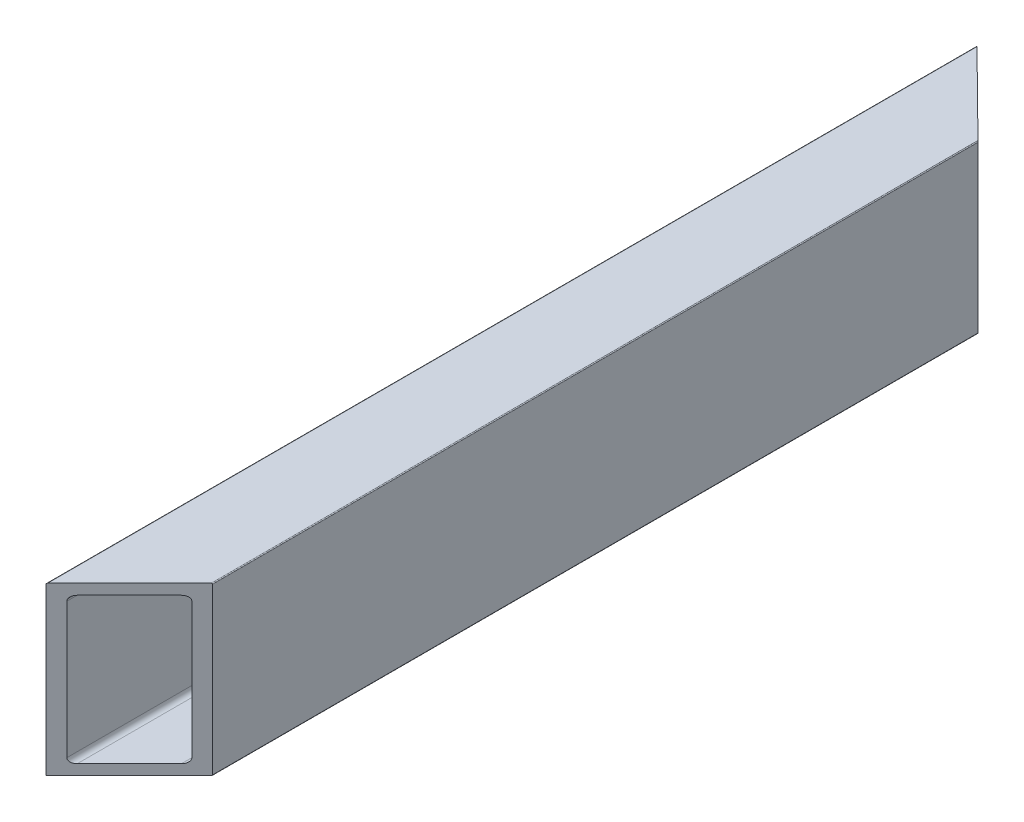
ISO-10303-21;
HEADER;
FILE_DESCRIPTION(('STEP AP214'),'2;1');
FILE_NAME('part.step','',(''),(''),'','','');
FILE_SCHEMA(('AUTOMOTIVE_DESIGN { 1 0 10303 214 1 1 1 1 }'));
ENDSEC;
DATA;
#1=APPLICATION_CONTEXT('core data for automotive mechanical design processes');
#2=APPLICATION_PROTOCOL_DEFINITION('international standard','automotive_design',2000,#1);
#3=PRODUCT_CONTEXT('',#1,'mechanical');
#4=PRODUCT('Part','Part','',(#3));
#5=PRODUCT_RELATED_PRODUCT_CATEGORY('part','',(#4));
#6=PRODUCT_DEFINITION_FORMATION('','',#4);
#7=PRODUCT_DEFINITION_CONTEXT('part definition',#1,'design');
#8=PRODUCT_DEFINITION('design','',#6,#7);
#9=PRODUCT_DEFINITION_SHAPE('','',#8);
#10=(LENGTH_UNIT() NAMED_UNIT(*) SI_UNIT(.MILLI.,.METRE.));
#11=(NAMED_UNIT(*) PLANE_ANGLE_UNIT() SI_UNIT($,.RADIAN.));
#12=(NAMED_UNIT(*) SI_UNIT($,.STERADIAN.) SOLID_ANGLE_UNIT());
#13=UNCERTAINTY_MEASURE_WITH_UNIT(LENGTH_MEASURE(1.E-05),#10,'distance_accuracy_value','');
#14=(GEOMETRIC_REPRESENTATION_CONTEXT(3) GLOBAL_UNCERTAINTY_ASSIGNED_CONTEXT((#13)) GLOBAL_UNIT_ASSIGNED_CONTEXT((#10,
#11,#12)) REPRESENTATION_CONTEXT('',''));
#15=CARTESIAN_POINT('',(0.,0.,0.));
#16=DIRECTION('',(0.,0.,1.));
#17=DIRECTION('',(1.,0.,0.));
#18=AXIS2_PLACEMENT_3D('',#15,#16,#17);
#19=CARTESIAN_POINT('',(3.175,4.7625,1828.8));
#20=DIRECTION('',(1.,0.,0.));
#21=DIRECTION('',(0.,1.,0.));
#22=AXIS2_PLACEMENT_3D('',#19,#20,#21);
#23=PLANE('',#22);
#24=DIRECTION('',(0.,1.,0.));
#25=VECTOR('',#24,1.);
#26=CARTESIAN_POINT('',(3.175,4.7625,280.506897551573));
#27=LINE('',#26,#25);
#28=CARTESIAN_POINT('',(3.175,4.7625,280.506897551572));
#29=VERTEX_POINT('',#28);
#30=CARTESIAN_POINT('',(3.175,46.0375,280.506897551572));
#31=VERTEX_POINT('',#30);
#32=EDGE_CURVE('E318',#29,#31,#27,.T.);
#33=ORIENTED_EDGE('',*,*,#32,.F.);
#34=DIRECTION('',(0.,0.,-1.));
#35=VECTOR('',#34,1.);
#36=CARTESIAN_POINT('',(3.175,4.7625,1828.8));
#37=LINE('',#36,#35);
#38=CARTESIAN_POINT('',(3.175,4.7625,3.13552437739006));
#39=VERTEX_POINT('',#38);
#40=EDGE_CURVE('E228',#29,#39,#37,.T.);
#41=ORIENTED_EDGE('',*,*,#40,.T.);
#42=DIRECTION('',(0.,-1.,0.));
#43=VECTOR('',#42,1.);
#44=CARTESIAN_POINT('',(3.175,4.7625,3.13552437739006));
#45=LINE('',#44,#43);
#46=CARTESIAN_POINT('',(3.175,46.0375,3.13552437739006));
#47=VERTEX_POINT('',#46);
#48=EDGE_CURVE('E273',#47,#39,#45,.T.);
#49=ORIENTED_EDGE('',*,*,#48,.F.);
#50=DIRECTION('',(0.,0.,-1.));
#51=VECTOR('',#50,1.);
#52=CARTESIAN_POINT('',(3.175,46.0375,1828.8));
#53=LINE('',#52,#51);
#54=EDGE_CURVE('E283',#31,#47,#53,.T.);
#55=ORIENTED_EDGE('',*,*,#54,.F.);
#56=EDGE_LOOP('',(#33,#41,#49,#55));
#57=FACE_BOUND('',#56,.T.);
#58=ADVANCED_FACE('F70',(#57),#23,.T.);
#59=CARTESIAN_POINT('',(4.7625,46.0375,1828.8));
#60=DIRECTION('',(0.,0.,-1.));
#61=DIRECTION('',(-1.,0.,0.));
#62=AXIS2_PLACEMENT_3D('',#59,#60,#61);
#63=CYLINDRICAL_SURFACE('',#62,1.5875);
#64=DIRECTION('',(0.,0.,-1.));
#65=VECTOR('',#64,1.);
#66=CARTESIAN_POINT('',(4.7625,47.625,1828.8));
#67=LINE('',#66,#65);
#68=CARTESIAN_POINT('',(4.76250000000011,47.625,278.919397551572));
#69=VERTEX_POINT('',#68);
#70=CARTESIAN_POINT('',(4.7625,47.625,4.70328656608532));
#71=VERTEX_POINT('',#70);
#72=EDGE_CURVE('E282',#69,#71,#67,.T.);
#73=ORIENTED_EDGE('',*,*,#72,.F.);
#74=CARTESIAN_POINT('',(4.7625,46.0375,278.919397551572));
#75=DIRECTION('',(-0.707106781186539,0.,-0.707106781186556));
#76=DIRECTION('',(0.707106781186556,0.,-0.707106781186539));
#77=AXIS2_PLACEMENT_3D('',#74,#75,#76);
#78=ELLIPSE('',#77,2.24506403026726,1.5875);
#79=EDGE_CURVE('E231',#69,#31,#78,.F.);
#80=ORIENTED_EDGE('',*,*,#79,.T.);
#81=ORIENTED_EDGE('',*,*,#54,.T.);
#82=CARTESIAN_POINT('',(4.7625,46.0375,4.70328656608521));
#83=DIRECTION('',(-0.702669711180683,0.,0.711516181818274));
#84=DIRECTION('',(-0.711516181818274,0.,-0.702669711180683));
#85=AXIS2_PLACEMENT_3D('',#82,#83,#84);
#86=ELLIPSE('',#85,2.23115094296683,1.5875);
#87=EDGE_CURVE('E278',#47,#71,#86,.F.);
#88=ORIENTED_EDGE('',*,*,#87,.T.);
#89=EDGE_LOOP('',(#73,#80,#81,#88));
#90=FACE_BOUND('',#89,.T.);
#91=ADVANCED_FACE('F372',(#90),#63,.F.);
#92=CARTESIAN_POINT('',(4.7625,47.625,1828.8));
#93=DIRECTION('',(0.,-1.,0.));
#94=DIRECTION('',(0.,0.,-1.));
#95=AXIS2_PLACEMENT_3D('',#92,#93,#94);
#96=PLANE('',#95);
#97=DIRECTION('',(0.707106781186556,0.,-0.707106781186539));
#98=VECTOR('',#97,1.);
#99=CARTESIAN_POINT('',(-770.177801224214,47.625,1053.85969877577));
#100=LINE('',#99,#98);
#101=CARTESIAN_POINT('',(20.6375,47.625,263.044397551573));
#102=VERTEX_POINT('',#101);
#103=EDGE_CURVE('E197',#69,#102,#100,.T.);
#104=ORIENTED_EDGE('',*,*,#103,.F.);
#105=ORIENTED_EDGE('',*,*,#72,.T.);
#106=DIRECTION('',(-0.711516181818274,0.,-0.702669711180683));
#107=VECTOR('',#106,1.);
#108=CARTESIAN_POINT('',(916.739479773578,47.625,905.341413085324));
#109=LINE('',#108,#107);
#110=CARTESIAN_POINT('',(20.6375,47.625,20.3809084530353));
#111=VERTEX_POINT('',#110);
#112=EDGE_CURVE('E284',#111,#71,#109,.T.);
#113=ORIENTED_EDGE('',*,*,#112,.F.);
#114=DIRECTION('',(0.,0.,-1.));
#115=VECTOR('',#114,1.);
#116=CARTESIAN_POINT('',(20.6375,47.625,1828.8));
#117=LINE('',#116,#115);
#118=EDGE_CURVE('E293',#102,#111,#117,.T.);
#119=ORIENTED_EDGE('',*,*,#118,.F.);
#120=EDGE_LOOP('',(#104,#105,#113,#119));
#121=FACE_BOUND('',#120,.T.);
#122=ADVANCED_FACE('F369',(#121),#96,.T.);
#123=CARTESIAN_POINT('',(20.6375,46.0375,1828.8));
#124=DIRECTION('',(0.,0.,-1.));
#125=DIRECTION('',(-1.,0.,0.));
#126=AXIS2_PLACEMENT_3D('',#123,#124,#125);
#127=CYLINDRICAL_SURFACE('',#126,1.5875);
#128=DIRECTION('',(0.,0.,-1.));
#129=VECTOR('',#128,1.);
#130=CARTESIAN_POINT('',(22.225,46.0375,1828.8));
#131=LINE('',#130,#129);
#132=CARTESIAN_POINT('',(22.225,46.0375,261.456897551573));
#133=VERTEX_POINT('',#132);
#134=CARTESIAN_POINT('',(22.225,46.0375,21.9486706417302));
#135=VERTEX_POINT('',#134);
#136=EDGE_CURVE('E207',#133,#135,#131,.T.);
#137=ORIENTED_EDGE('',*,*,#136,.F.);
#138=CARTESIAN_POINT('',(20.6375,46.0375,263.044397551573));
#139=DIRECTION('',(-0.707106781186539,0.,-0.707106781186556));
#140=DIRECTION('',(0.707106781186556,0.,-0.707106781186539));
#141=AXIS2_PLACEMENT_3D('',#138,#139,#140);
#142=ELLIPSE('',#141,2.24506403026726,1.5875);
#143=EDGE_CURVE('E192',#133,#102,#142,.F.);
#144=ORIENTED_EDGE('',*,*,#143,.T.);
#145=ORIENTED_EDGE('',*,*,#118,.T.);
#146=CARTESIAN_POINT('',(20.6375,46.0375,20.3809084530353));
#147=DIRECTION('',(-0.702669711180683,0.,0.711516181818274));
#148=DIRECTION('',(-0.711516181818274,0.,-0.702669711180683));
#149=AXIS2_PLACEMENT_3D('',#146,#147,#148);
#150=ELLIPSE('',#149,2.23115094296683,1.5875);
#151=EDGE_CURVE('E289',#111,#135,#150,.F.);
#152=ORIENTED_EDGE('',*,*,#151,.T.);
#153=EDGE_LOOP('',(#137,#144,#145,#152));
#154=FACE_BOUND('',#153,.T.);
#155=ADVANCED_FACE('F361',(#154),#127,.F.);
#156=CARTESIAN_POINT('',(22.225,4.7625,1828.8));
#157=DIRECTION('',(-1.,0.,0.));
#158=DIRECTION('',(0.,0.,1.));
#159=AXIS2_PLACEMENT_3D('',#156,#157,#158);
#160=PLANE('',#159);
#161=DIRECTION('',(0.,-1.,0.));
#162=VECTOR('',#161,1.);
#163=CARTESIAN_POINT('',(22.225,4.7625,261.456897551573));
#164=LINE('',#163,#162);
#165=CARTESIAN_POINT('',(22.225,4.7625,261.456897551573));
#166=VERTEX_POINT('',#165);
#167=EDGE_CURVE('E187',#133,#166,#164,.T.);
#168=ORIENTED_EDGE('',*,*,#167,.F.);
#169=ORIENTED_EDGE('',*,*,#136,.T.);
#170=DIRECTION('',(0.,1.,0.));
#171=VECTOR('',#170,1.);
#172=CARTESIAN_POINT('',(22.225,4.7625,21.9486706417302));
#173=LINE('',#172,#171);
#174=CARTESIAN_POINT('',(22.225,4.7625,21.9486706417305));
#175=VERTEX_POINT('',#174);
#176=EDGE_CURVE('E212',#175,#135,#173,.T.);
#177=ORIENTED_EDGE('',*,*,#176,.F.);
#178=DIRECTION('',(0.,0.,-1.));
#179=VECTOR('',#178,1.);
#180=CARTESIAN_POINT('',(22.225,4.7625,1828.8));
#181=LINE('',#180,#179);
#182=EDGE_CURVE('E203',#166,#175,#181,.T.);
#183=ORIENTED_EDGE('',*,*,#182,.F.);
#184=EDGE_LOOP('',(#168,#169,#177,#183));
#185=FACE_BOUND('',#184,.T.);
#186=ADVANCED_FACE('F210',(#185),#160,.T.);
#187=CARTESIAN_POINT('',(20.6375,4.7625,1828.8));
#188=DIRECTION('',(0.,0.,-1.));
#189=DIRECTION('',(-1.,0.,0.));
#190=AXIS2_PLACEMENT_3D('',#187,#188,#189);
#191=CYLINDRICAL_SURFACE('',#190,1.5875);
#192=DIRECTION('',(0.,0.,-1.));
#193=VECTOR('',#192,1.);
#194=CARTESIAN_POINT('',(20.6375,3.175,1828.8));
#195=LINE('',#194,#193);
#196=CARTESIAN_POINT('',(20.6375,3.175,263.044397551573));
#197=VERTEX_POINT('',#196);
#198=CARTESIAN_POINT('',(20.6375,3.175,20.3809084530353));
#199=VERTEX_POINT('',#198);
#200=EDGE_CURVE('E205',#197,#199,#195,.T.);
#201=ORIENTED_EDGE('',*,*,#200,.F.);
#202=CARTESIAN_POINT('',(20.6375,4.7625,263.044397551573));
#203=DIRECTION('',(-0.707106781186539,0.,-0.707106781186556));
#204=DIRECTION('',(0.707106781186556,0.,-0.707106781186539));
#205=AXIS2_PLACEMENT_3D('',#202,#203,#204);
#206=ELLIPSE('',#205,2.24506403026726,1.5875);
#207=EDGE_CURVE('E190',#197,#166,#206,.F.);
#208=ORIENTED_EDGE('',*,*,#207,.T.);
#209=ORIENTED_EDGE('',*,*,#182,.T.);
#210=CARTESIAN_POINT('',(20.6375,4.7625,20.3809084530353));
#211=DIRECTION('',(-0.702669711180683,0.,0.711516181818274));
#212=DIRECTION('',(-0.711516181818274,0.,-0.702669711180683));
#213=AXIS2_PLACEMENT_3D('',#210,#211,#212);
#214=ELLIPSE('',#213,2.23115094296683,1.5875);
#215=EDGE_CURVE('E214',#175,#199,#214,.F.);
#216=ORIENTED_EDGE('',*,*,#215,.T.);
#217=EDGE_LOOP('',(#201,#208,#209,#216));
#218=FACE_BOUND('',#217,.T.);
#219=ADVANCED_FACE('F201',(#218),#191,.F.);
#220=CARTESIAN_POINT('',(4.7625,3.175,1828.8));
#221=DIRECTION('',(0.,1.,0.));
#222=DIRECTION('',(1.,0.,0.));
#223=AXIS2_PLACEMENT_3D('',#220,#221,#222);
#224=PLANE('',#223);
#225=DIRECTION('',(-0.707106781186556,0.,0.707106781186539));
#226=VECTOR('',#225,1.);
#227=CARTESIAN_POINT('',(-770.177801224214,3.175,1053.85969877577));
#228=LINE('',#227,#226);
#229=CARTESIAN_POINT('',(4.7625,3.175,278.919397551572));
#230=VERTEX_POINT('',#229);
#231=EDGE_CURVE('E120',#197,#230,#228,.T.);
#232=ORIENTED_EDGE('',*,*,#231,.F.);
#233=ORIENTED_EDGE('',*,*,#200,.T.);
#234=DIRECTION('',(0.711516181818274,0.,0.702669711180683));
#235=VECTOR('',#234,1.);
#236=CARTESIAN_POINT('',(916.739479773578,3.175,905.341413085324));
#237=LINE('',#236,#235);
#238=CARTESIAN_POINT('',(4.7625,3.175,4.70328656608521));
#239=VERTEX_POINT('',#238);
#240=EDGE_CURVE('E277',#239,#199,#237,.T.);
#241=ORIENTED_EDGE('',*,*,#240,.F.);
#242=DIRECTION('',(0.,0.,-1.));
#243=VECTOR('',#242,1.);
#244=CARTESIAN_POINT('',(4.7625,3.175,1828.8));
#245=LINE('',#244,#243);
#246=EDGE_CURVE('E224',#230,#239,#245,.T.);
#247=ORIENTED_EDGE('',*,*,#246,.F.);
#248=EDGE_LOOP('',(#232,#233,#241,#247));
#249=FACE_BOUND('',#248,.T.);
#250=ADVANCED_FACE('F383',(#249),#224,.T.);
#251=CARTESIAN_POINT('',(4.7625,4.7625,1828.8));
#252=DIRECTION('',(0.,0.,-1.));
#253=DIRECTION('',(-1.,0.,0.));
#254=AXIS2_PLACEMENT_3D('',#251,#252,#253);
#255=CYLINDRICAL_SURFACE('',#254,1.5875);
#256=ORIENTED_EDGE('',*,*,#40,.F.);
#257=CARTESIAN_POINT('',(4.7625,4.7625,278.919397551572));
#258=DIRECTION('',(-0.707106781186539,0.,-0.707106781186556));
#259=DIRECTION('',(0.707106781186556,0.,-0.707106781186539));
#260=AXIS2_PLACEMENT_3D('',#257,#258,#259);
#261=ELLIPSE('',#260,2.24506403026726,1.5875);
#262=EDGE_CURVE('E114',#29,#230,#261,.F.);
#263=ORIENTED_EDGE('',*,*,#262,.T.);
#264=ORIENTED_EDGE('',*,*,#246,.T.);
#265=CARTESIAN_POINT('',(4.7625,4.7625,4.70328656608521));
#266=DIRECTION('',(-0.702669711180683,0.,0.711516181818274));
#267=DIRECTION('',(-0.711516181818274,0.,-0.702669711180683));
#268=AXIS2_PLACEMENT_3D('',#265,#266,#267);
#269=ELLIPSE('',#268,2.23115094296683,1.5875);
#270=EDGE_CURVE('E227',#239,#39,#269,.F.);
#271=ORIENTED_EDGE('',*,*,#270,.T.);
#272=EDGE_LOOP('',(#256,#263,#264,#271));
#273=FACE_BOUND('',#272,.T.);
#274=ADVANCED_FACE('F379',(#273),#255,.F.);
#275=CARTESIAN_POINT('',(0.,0.254,1828.8));
#276=DIRECTION('',(1.,0.,0.));
#277=DIRECTION('',(0.,1.,0.));
#278=AXIS2_PLACEMENT_3D('',#275,#276,#277);
#279=PLANE('',#278);
#280=DIRECTION('',(0.,0.,-1.));
#281=VECTOR('',#280,1.);
#282=CARTESIAN_POINT('',(0.,0.254,1828.8));
#283=LINE('',#282,#281);
#284=CARTESIAN_POINT('',(0.,0.254,283.681897551572));
#285=VERTEX_POINT('',#284);
#286=CARTESIAN_POINT('',(0.,0.254,0.));
#287=VERTEX_POINT('',#286);
#288=EDGE_CURVE('E251',#285,#287,#283,.T.);
#289=ORIENTED_EDGE('',*,*,#288,.F.);
#290=DIRECTION('',(0.,1.,0.));
#291=VECTOR('',#290,1.);
#292=CARTESIAN_POINT('',(0.,0.254,283.681897551572));
#293=LINE('',#292,#291);
#294=CARTESIAN_POINT('',(0.,50.546,283.681897551572));
#295=VERTEX_POINT('',#294);
#296=EDGE_CURVE('E270',#285,#295,#293,.T.);
#297=ORIENTED_EDGE('',*,*,#296,.T.);
#298=DIRECTION('',(0.,0.,-1.));
#299=VECTOR('',#298,1.);
#300=CARTESIAN_POINT('',(0.,50.546,1828.8));
#301=LINE('',#300,#299);
#302=CARTESIAN_POINT('',(0.,50.546,0.));
#303=VERTEX_POINT('',#302);
#304=EDGE_CURVE('E267',#295,#303,#301,.T.);
#305=ORIENTED_EDGE('',*,*,#304,.T.);
#306=DIRECTION('',(0.,-1.,0.));
#307=VECTOR('',#306,1.);
#308=CARTESIAN_POINT('',(0.,0.254,0.));
#309=LINE('',#308,#307);
#310=EDGE_CURVE('E236',#303,#287,#309,.T.);
#311=ORIENTED_EDGE('',*,*,#310,.T.);
#312=EDGE_LOOP('',(#289,#297,#305,#311));
#313=FACE_BOUND('',#312,.T.);
#314=ADVANCED_FACE('F390',(#313),#279,.F.);
#315=CARTESIAN_POINT('',(0.254,50.546,1828.8));
#316=DIRECTION('',(0.,0.,-1.));
#317=DIRECTION('',(-1.,0.,0.));
#318=AXIS2_PLACEMENT_3D('',#315,#316,#317);
#319=CYLINDRICAL_SURFACE('',#318,0.253999999999995);
#320=CARTESIAN_POINT('',(0.254,50.546,283.427897551572));
#321=DIRECTION('',(-0.707106781186539,0.,-0.707106781186556));
#322=DIRECTION('',(0.707106781186556,0.,-0.707106781186539));
#323=AXIS2_PLACEMENT_3D('',#320,#321,#322);
#324=ELLIPSE('',#323,0.359210244842755,0.253999999999995);
#325=CARTESIAN_POINT('',(0.253999999999921,50.8,283.427897551572));
#326=VERTEX_POINT('',#325);
#327=EDGE_CURVE('E341',#326,#295,#324,.F.);
#328=ORIENTED_EDGE('',*,*,#327,.F.);
#329=DIRECTION('',(0.,0.,-1.));
#330=VECTOR('',#329,1.);
#331=CARTESIAN_POINT('',(0.254,50.8,1828.8));
#332=LINE('',#331,#330);
#333=CARTESIAN_POINT('',(0.254000000000101,50.8,0.250841950191301));
#334=VERTEX_POINT('',#333);
#335=EDGE_CURVE('E232',#326,#334,#332,.T.);
#336=ORIENTED_EDGE('',*,*,#335,.T.);
#337=CARTESIAN_POINT('',(0.254,50.546,0.250841950191205));
#338=DIRECTION('',(-0.702669711180683,0.,0.711516181818274));
#339=DIRECTION('',(-0.711516181818274,0.,-0.702669711180683));
#340=AXIS2_PLACEMENT_3D('',#337,#338,#339);
#341=ELLIPSE('',#340,0.356984150874686,0.253999999999995);
#342=EDGE_CURVE('E288',#303,#334,#341,.F.);
#343=ORIENTED_EDGE('',*,*,#342,.F.);
#344=ORIENTED_EDGE('',*,*,#304,.F.);
#345=EDGE_LOOP('',(#328,#336,#343,#344));
#346=FACE_BOUND('',#345,.T.);
#347=ADVANCED_FACE('F432',(#346),#319,.T.);
#348=CARTESIAN_POINT('',(0.254,50.8,1828.8));
#349=DIRECTION('',(0.,-1.,0.));
#350=DIRECTION('',(0.,0.,-1.));
#351=AXIS2_PLACEMENT_3D('',#348,#349,#350);
#352=PLANE('',#351);
#353=ORIENTED_EDGE('',*,*,#335,.F.);
#354=DIRECTION('',(0.707106781186556,0.,-0.707106781186539));
#355=VECTOR('',#354,1.);
#356=CARTESIAN_POINT('',(141.840948775786,50.8,141.84094877579));
#357=LINE('',#356,#355);
#358=CARTESIAN_POINT('',(25.146,50.8,258.535897551573));
#359=VERTEX_POINT('',#358);
#360=EDGE_CURVE('E235',#326,#359,#357,.T.);
#361=ORIENTED_EDGE('',*,*,#360,.T.);
#362=DIRECTION('',(0.,0.,-1.));
#363=VECTOR('',#362,1.);
#364=CARTESIAN_POINT('',(25.146,50.8,1828.8));
#365=LINE('',#364,#363);
#366=CARTESIAN_POINT('',(25.146,50.8,24.833353068929));
#367=VERTEX_POINT('',#366);
#368=EDGE_CURVE('E237',#359,#367,#365,.T.);
#369=ORIENTED_EDGE('',*,*,#368,.T.);
#370=DIRECTION('',(-0.711516181818274,0.,-0.702669711180683));
#371=VECTOR('',#370,1.);
#372=CARTESIAN_POINT('',(0.,50.8,0.));
#373=LINE('',#372,#371);
#374=EDGE_CURVE('E239',#367,#334,#373,.T.);
#375=ORIENTED_EDGE('',*,*,#374,.T.);
#376=EDGE_LOOP('',(#353,#361,#369,#375));
#377=FACE_BOUND('',#376,.T.);
#378=ADVANCED_FACE('F442',(#377),#352,.F.);
#379=CARTESIAN_POINT('',(25.146,50.546,1828.8));
#380=DIRECTION('',(0.,0.,-1.));
#381=DIRECTION('',(-1.,0.,0.));
#382=AXIS2_PLACEMENT_3D('',#379,#380,#381);
#383=CYLINDRICAL_SURFACE('',#382,0.253999999999994);
#384=CARTESIAN_POINT('',(25.146,50.546,258.535897551573));
#385=DIRECTION('',(-0.707106781186539,0.,-0.707106781186556));
#386=DIRECTION('',(0.707106781186556,0.,-0.707106781186539));
#387=AXIS2_PLACEMENT_3D('',#384,#385,#386);
#388=ELLIPSE('',#387,0.359210244842753,0.253999999999994);
#389=CARTESIAN_POINT('',(25.4,50.546,258.281897551573));
#390=VERTEX_POINT('',#389);
#391=EDGE_CURVE('E106',#390,#359,#388,.F.);
#392=ORIENTED_EDGE('',*,*,#391,.F.);
#393=DIRECTION('',(0.,0.,-1.));
#394=VECTOR('',#393,1.);
#395=CARTESIAN_POINT('',(25.4,50.546,1828.8));
#396=LINE('',#395,#394);
#397=CARTESIAN_POINT('',(25.4,50.546,25.0841950191202));
#398=VERTEX_POINT('',#397);
#399=EDGE_CURVE('E259',#390,#398,#396,.T.);
#400=ORIENTED_EDGE('',*,*,#399,.T.);
#401=CARTESIAN_POINT('',(25.146,50.546,24.8333530689291));
#402=DIRECTION('',(-0.702669711180683,0.,0.711516181818274));
#403=DIRECTION('',(-0.711516181818274,0.,-0.702669711180683));
#404=AXIS2_PLACEMENT_3D('',#401,#402,#403);
#405=ELLIPSE('',#404,0.356984150874684,0.253999999999994);
#406=EDGE_CURVE('E305',#367,#398,#405,.F.);
#407=ORIENTED_EDGE('',*,*,#406,.F.);
#408=ORIENTED_EDGE('',*,*,#368,.F.);
#409=EDGE_LOOP('',(#392,#400,#407,#408));
#410=FACE_BOUND('',#409,.T.);
#411=ADVANCED_FACE('F452',(#410),#383,.T.);
#412=CARTESIAN_POINT('',(25.4,0.254,1828.8));
#413=DIRECTION('',(-1.,0.,0.));
#414=DIRECTION('',(0.,0.,1.));
#415=AXIS2_PLACEMENT_3D('',#412,#413,#414);
#416=PLANE('',#415);
#417=ORIENTED_EDGE('',*,*,#399,.F.);
#418=DIRECTION('',(0.,-1.,0.));
#419=VECTOR('',#418,1.);
#420=CARTESIAN_POINT('',(25.4,0.254,258.281897551573));
#421=LINE('',#420,#419);
#422=CARTESIAN_POINT('',(25.4,0.254,258.281897551573));
#423=VERTEX_POINT('',#422);
#424=EDGE_CURVE('E88',#390,#423,#421,.T.);
#425=ORIENTED_EDGE('',*,*,#424,.T.);
#426=DIRECTION('',(0.,0.,-1.));
#427=VECTOR('',#426,1.);
#428=CARTESIAN_POINT('',(25.4,0.254,1828.8));
#429=LINE('',#428,#427);
#430=CARTESIAN_POINT('',(25.4,0.253999999999997,25.0841950191202));
#431=VERTEX_POINT('',#430);
#432=EDGE_CURVE('E242',#423,#431,#429,.T.);
#433=ORIENTED_EDGE('',*,*,#432,.T.);
#434=DIRECTION('',(0.,-1.,0.));
#435=VECTOR('',#434,1.);
#436=CARTESIAN_POINT('',(25.4,50.8,25.0841950191202));
#437=LINE('',#436,#435);
#438=EDGE_CURVE('E309',#398,#431,#437,.T.);
#439=ORIENTED_EDGE('',*,*,#438,.F.);
#440=EDGE_LOOP('',(#417,#425,#433,#439));
#441=FACE_BOUND('',#440,.T.);
#442=ADVANCED_FACE('F462',(#441),#416,.F.);
#443=CARTESIAN_POINT('',(25.146,0.254,1828.8));
#444=DIRECTION('',(0.,0.,-1.));
#445=DIRECTION('',(-1.,0.,0.));
#446=AXIS2_PLACEMENT_3D('',#443,#444,#445);
#447=CYLINDRICAL_SURFACE('',#446,0.254);
#448=CARTESIAN_POINT('',(25.146,0.254,258.535897551573));
#449=DIRECTION('',(-0.707106781186539,0.,-0.707106781186556));
#450=DIRECTION('',(0.707106781186556,0.,-0.707106781186539));
#451=AXIS2_PLACEMENT_3D('',#448,#449,#450);
#452=ELLIPSE('',#451,0.359210244842762,0.254);
#453=CARTESIAN_POINT('',(25.146,0.,258.535897551573));
#454=VERTEX_POINT('',#453);
#455=EDGE_CURVE('E12',#454,#423,#452,.F.);
#456=ORIENTED_EDGE('',*,*,#455,.F.);
#457=DIRECTION('',(0.,0.,-1.));
#458=VECTOR('',#457,1.);
#459=CARTESIAN_POINT('',(25.146,0.,1828.8));
#460=LINE('',#459,#458);
#461=CARTESIAN_POINT('',(25.1460000000001,0.,24.8333530689291));
#462=VERTEX_POINT('',#461);
#463=EDGE_CURVE('E240',#454,#462,#460,.T.);
#464=ORIENTED_EDGE('',*,*,#463,.T.);
#465=CARTESIAN_POINT('',(25.146,0.254,24.8333530689291));
#466=DIRECTION('',(-0.702669711180683,0.,0.711516181818274));
#467=DIRECTION('',(-0.711516181818274,0.,-0.702669711180683));
#468=AXIS2_PLACEMENT_3D('',#465,#466,#467);
#469=ELLIPSE('',#468,0.356984150874693,0.254);
#470=EDGE_CURVE('E310',#431,#462,#469,.F.);
#471=ORIENTED_EDGE('',*,*,#470,.F.);
#472=ORIENTED_EDGE('',*,*,#432,.F.);
#473=EDGE_LOOP('',(#456,#464,#471,#472));
#474=FACE_BOUND('',#473,.T.);
#475=ADVANCED_FACE('F472',(#474),#447,.T.);
#476=CARTESIAN_POINT('',(0.254,0.,1828.8));
#477=DIRECTION('',(0.,1.,0.));
#478=DIRECTION('',(1.,0.,0.));
#479=AXIS2_PLACEMENT_3D('',#476,#477,#478);
#480=PLANE('',#479);
#481=ORIENTED_EDGE('',*,*,#463,.F.);
#482=DIRECTION('',(0.707106781186556,0.,-0.707106781186539));
#483=VECTOR('',#482,1.);
#484=CARTESIAN_POINT('',(141.840948775786,0.,141.84094877579));
#485=LINE('',#484,#483);
#486=CARTESIAN_POINT('',(0.254,0.,283.427897551572));
#487=VERTEX_POINT('',#486);
#488=EDGE_CURVE('E80',#487,#454,#485,.T.);
#489=ORIENTED_EDGE('',*,*,#488,.F.);
#490=DIRECTION('',(0.,0.,-1.));
#491=VECTOR('',#490,1.);
#492=CARTESIAN_POINT('',(0.254,0.,1828.8));
#493=LINE('',#492,#491);
#494=CARTESIAN_POINT('',(0.253999999999932,0.,0.250841950191026));
#495=VERTEX_POINT('',#494);
#496=EDGE_CURVE('E73',#487,#495,#493,.T.);
#497=ORIENTED_EDGE('',*,*,#496,.T.);
#498=DIRECTION('',(-0.711516181818274,0.,-0.702669711180683));
#499=VECTOR('',#498,1.);
#500=CARTESIAN_POINT('',(0.,0.,0.));
#501=LINE('',#500,#499);
#502=EDGE_CURVE('E313',#462,#495,#501,.T.);
#503=ORIENTED_EDGE('',*,*,#502,.F.);
#504=EDGE_LOOP('',(#481,#489,#497,#503));
#505=FACE_BOUND('',#504,.T.);
#506=ADVANCED_FACE('F481',(#505),#480,.F.);
#507=CARTESIAN_POINT('',(0.254,0.254,1828.8));
#508=DIRECTION('',(0.,0.,-1.));
#509=DIRECTION('',(-1.,0.,0.));
#510=AXIS2_PLACEMENT_3D('',#507,#508,#509);
#511=CYLINDRICAL_SURFACE('',#510,0.254);
#512=CARTESIAN_POINT('',(0.254,0.254,283.427897551572));
#513=DIRECTION('',(-0.707106781186539,0.,-0.707106781186556));
#514=DIRECTION('',(0.707106781186556,0.,-0.707106781186539));
#515=AXIS2_PLACEMENT_3D('',#512,#513,#514);
#516=ELLIPSE('',#515,0.359210244842762,0.254);
#517=EDGE_CURVE('E345',#285,#487,#516,.F.);
#518=ORIENTED_EDGE('',*,*,#517,.F.);
#519=ORIENTED_EDGE('',*,*,#288,.T.);
#520=CARTESIAN_POINT('',(0.254,0.254,0.250841950191205));
#521=DIRECTION('',(-0.702669711180683,0.,0.711516181818274));
#522=DIRECTION('',(-0.711516181818274,0.,-0.702669711180683));
#523=AXIS2_PLACEMENT_3D('',#520,#521,#522);
#524=ELLIPSE('',#523,0.356984150874693,0.254);
#525=EDGE_CURVE('E314',#495,#287,#524,.F.);
#526=ORIENTED_EDGE('',*,*,#525,.F.);
#527=ORIENTED_EDGE('',*,*,#496,.F.);
#528=EDGE_LOOP('',(#518,#519,#526,#527));
#529=FACE_BOUND('',#528,.T.);
#530=ADVANCED_FACE('F490',(#529),#511,.T.);
#531=CARTESIAN_POINT('',(0.,50.8,0.));
#532=DIRECTION('',(-0.702669711180683,0.,0.711516181818274));
#533=DIRECTION('',(0.711516181818274,0.,0.702669711180683));
#534=AXIS2_PLACEMENT_3D('',#531,#532,#533);
#535=PLANE('',#534);
#536=ORIENTED_EDGE('',*,*,#48,.T.);
#537=ORIENTED_EDGE('',*,*,#270,.F.);
#538=ORIENTED_EDGE('',*,*,#240,.T.);
#539=ORIENTED_EDGE('',*,*,#215,.F.);
#540=ORIENTED_EDGE('',*,*,#176,.T.);
#541=ORIENTED_EDGE('',*,*,#151,.F.);
#542=ORIENTED_EDGE('',*,*,#112,.T.);
#543=ORIENTED_EDGE('',*,*,#87,.F.);
#544=EDGE_LOOP('',(#536,#537,#538,#539,#540,#541,#542,#543));
#545=FACE_BOUND('',#544,.T.);
#546=ORIENTED_EDGE('',*,*,#342,.T.);
#547=ORIENTED_EDGE('',*,*,#374,.F.);
#548=ORIENTED_EDGE('',*,*,#406,.T.);
#549=ORIENTED_EDGE('',*,*,#438,.T.);
#550=ORIENTED_EDGE('',*,*,#470,.T.);
#551=ORIENTED_EDGE('',*,*,#502,.T.);
#552=ORIENTED_EDGE('',*,*,#525,.T.);
#553=ORIENTED_EDGE('',*,*,#310,.F.);
#554=EDGE_LOOP('',(#546,#547,#548,#549,#550,#551,#552,#553));
#555=FACE_BOUND('',#554,.T.);
#556=ADVANCED_FACE('F366',(#545,#555),#535,.F.);
#557=CARTESIAN_POINT('',(141.840948775786,50.8,141.84094877579));
#558=DIRECTION('',(-0.707106781186539,0.,-0.707106781186556));
#559=DIRECTION('',(-0.707106781186556,0.,0.707106781186539));
#560=AXIS2_PLACEMENT_3D('',#557,#558,#559);
#561=PLANE('',#560);
#562=ORIENTED_EDGE('',*,*,#32,.T.);
#563=ORIENTED_EDGE('',*,*,#79,.F.);
#564=ORIENTED_EDGE('',*,*,#103,.T.);
#565=ORIENTED_EDGE('',*,*,#143,.F.);
#566=ORIENTED_EDGE('',*,*,#167,.T.);
#567=ORIENTED_EDGE('',*,*,#207,.F.);
#568=ORIENTED_EDGE('',*,*,#231,.T.);
#569=ORIENTED_EDGE('',*,*,#262,.F.);
#570=EDGE_LOOP('',(#562,#563,#564,#565,#566,#567,#568,#569));
#571=FACE_BOUND('',#570,.T.);
#572=ORIENTED_EDGE('',*,*,#391,.T.);
#573=ORIENTED_EDGE('',*,*,#360,.F.);
#574=ORIENTED_EDGE('',*,*,#327,.T.);
#575=ORIENTED_EDGE('',*,*,#296,.F.);
#576=ORIENTED_EDGE('',*,*,#517,.T.);
#577=ORIENTED_EDGE('',*,*,#488,.T.);
#578=ORIENTED_EDGE('',*,*,#455,.T.);
#579=ORIENTED_EDGE('',*,*,#424,.F.);
#580=EDGE_LOOP('',(#572,#573,#574,#575,#576,#577,#578,#579));
#581=FACE_BOUND('',#580,.T.);
#582=ADVANCED_FACE('F189',(#571,#581),#561,.F.);
#583=CLOSED_SHELL('',(#58,#91,#122,#155,#186,#219,#250,#274,#314,#347,#378,#411,#442,#475,#506,
#530,#556,#582));
#584=MANIFOLD_SOLID_BREP('B2',#583);
#585=ADVANCED_BREP_SHAPE_REPRESENTATION('',(#18,#584),#14);
#586=SHAPE_DEFINITION_REPRESENTATION(#9,#585);
ENDSEC;
END-ISO-10303-21;
